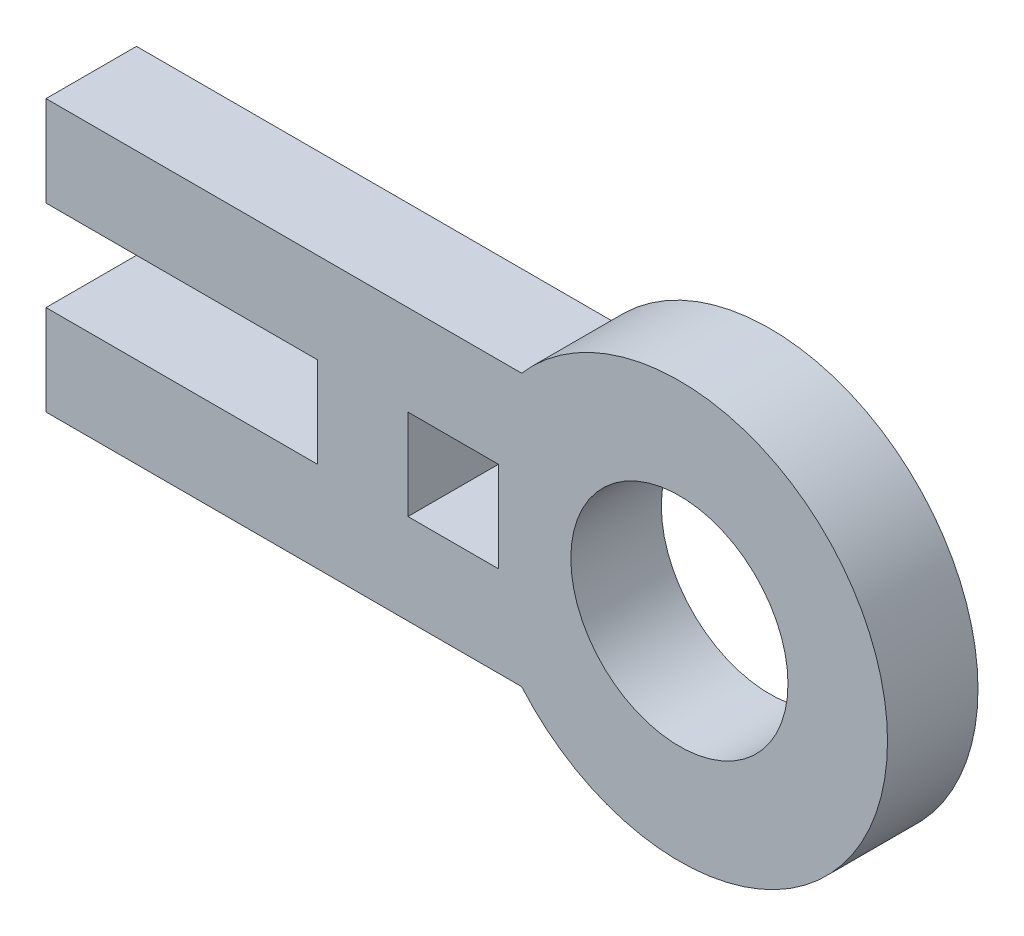
ISO-10303-21;
HEADER;
FILE_DESCRIPTION(('STEP AP214'),'2;1');
FILE_NAME('part.step','',(''),(''),'','','');
FILE_SCHEMA(('AUTOMOTIVE_DESIGN { 1 0 10303 214 1 1 1 1 }'));
ENDSEC;
DATA;
#1=APPLICATION_CONTEXT('core data for automotive mechanical design processes');
#2=APPLICATION_PROTOCOL_DEFINITION('international standard','automotive_design',2000,#1);
#3=PRODUCT_CONTEXT('',#1,'mechanical');
#4=PRODUCT('Part','Part','',(#3));
#5=PRODUCT_RELATED_PRODUCT_CATEGORY('part','',(#4));
#6=PRODUCT_DEFINITION_FORMATION('','',#4);
#7=PRODUCT_DEFINITION_CONTEXT('part definition',#1,'design');
#8=PRODUCT_DEFINITION('design','',#6,#7);
#9=PRODUCT_DEFINITION_SHAPE('','',#8);
#10=(LENGTH_UNIT() NAMED_UNIT(*) SI_UNIT(.MILLI.,.METRE.));
#11=(NAMED_UNIT(*) PLANE_ANGLE_UNIT() SI_UNIT($,.RADIAN.));
#12=(NAMED_UNIT(*) SI_UNIT($,.STERADIAN.) SOLID_ANGLE_UNIT());
#13=UNCERTAINTY_MEASURE_WITH_UNIT(LENGTH_MEASURE(1.E-05),#10,'distance_accuracy_value','');
#14=(GEOMETRIC_REPRESENTATION_CONTEXT(3) GLOBAL_UNCERTAINTY_ASSIGNED_CONTEXT((#13)) GLOBAL_UNIT_ASSIGNED_CONTEXT((#10,
#11,#12)) REPRESENTATION_CONTEXT('',''));
#15=CARTESIAN_POINT('',(0.,0.,0.));
#16=DIRECTION('',(0.,0.,1.));
#17=DIRECTION('',(1.,0.,0.));
#18=AXIS2_PLACEMENT_3D('',#15,#16,#17);
#19=CARTESIAN_POINT('',(0.,0.,5.));
#20=DIRECTION('',(0.,0.,1.));
#21=DIRECTION('',(1.,0.,0.));
#22=AXIS2_PLACEMENT_3D('',#19,#20,#21);
#23=PLANE('',#22);
#24=DIRECTION('',(0.,1.,0.));
#25=VECTOR('',#24,1.);
#26=CARTESIAN_POINT('',(-20.,0.,5.));
#27=LINE('',#26,#25);
#28=CARTESIAN_POINT('',(-20.,-2.5,5.));
#29=VERTEX_POINT('',#28);
#30=CARTESIAN_POINT('',(-20.,2.5,5.));
#31=VERTEX_POINT('',#30);
#32=EDGE_CURVE('E156',#29,#31,#27,.T.);
#33=ORIENTED_EDGE('',*,*,#32,.F.);
#34=DIRECTION('',(-1.,0.,0.));
#35=VECTOR('',#34,1.);
#36=CARTESIAN_POINT('',(0.,-2.49999999999999,5.));
#37=LINE('',#36,#35);
#38=CARTESIAN_POINT('',(-35.,-2.5,5.));
#39=VERTEX_POINT('',#38);
#40=EDGE_CURVE('E159',#29,#39,#37,.T.);
#41=ORIENTED_EDGE('',*,*,#40,.T.);
#42=DIRECTION('',(0.,1.,0.));
#43=VECTOR('',#42,1.);
#44=CARTESIAN_POINT('',(-35.,0.,5.));
#45=LINE('',#44,#43);
#46=CARTESIAN_POINT('',(-35.,-7.5,5.));
#47=VERTEX_POINT('',#46);
#48=EDGE_CURVE('E162',#47,#39,#45,.T.);
#49=ORIENTED_EDGE('',*,*,#48,.F.);
#50=DIRECTION('',(-1.,0.,0.));
#51=VECTOR('',#50,1.);
#52=CARTESIAN_POINT('',(0.,-7.5,5.));
#53=LINE('',#52,#51);
#54=CARTESIAN_POINT('',(-8.71779788708135,-7.5,5.));
#55=VERTEX_POINT('',#54);
#56=EDGE_CURVE('E165',#55,#47,#53,.T.);
#57=ORIENTED_EDGE('',*,*,#56,.F.);
#58=CARTESIAN_POINT('',(0.,0.,5.));
#59=DIRECTION('',(0.,0.,1.));
#60=DIRECTION('',(1.,0.,0.));
#61=AXIS2_PLACEMENT_3D('',#58,#59,#60);
#62=CIRCLE('',#61,11.5);
#63=CARTESIAN_POINT('',(-8.71779788708135,7.5,5.));
#64=VERTEX_POINT('',#63);
#65=EDGE_CURVE('E168',#55,#64,#62,.T.);
#66=ORIENTED_EDGE('',*,*,#65,.T.);
#67=DIRECTION('',(1.,0.,0.));
#68=VECTOR('',#67,1.);
#69=CARTESIAN_POINT('',(0.,7.5,5.));
#70=LINE('',#69,#68);
#71=CARTESIAN_POINT('',(-35.,7.5,5.));
#72=VERTEX_POINT('',#71);
#73=EDGE_CURVE('E170',#72,#64,#70,.T.);
#74=ORIENTED_EDGE('',*,*,#73,.F.);
#75=DIRECTION('',(0.,1.,0.));
#76=VECTOR('',#75,1.);
#77=CARTESIAN_POINT('',(-35.,0.,5.));
#78=LINE('',#77,#76);
#79=CARTESIAN_POINT('',(-35.,2.5,5.));
#80=VERTEX_POINT('',#79);
#81=EDGE_CURVE('E173',#80,#72,#78,.T.);
#82=ORIENTED_EDGE('',*,*,#81,.F.);
#83=DIRECTION('',(-1.,0.,0.));
#84=VECTOR('',#83,1.);
#85=CARTESIAN_POINT('',(0.,2.5,5.));
#86=LINE('',#85,#84);
#87=EDGE_CURVE('E176',#31,#80,#86,.T.);
#88=ORIENTED_EDGE('',*,*,#87,.F.);
#89=EDGE_LOOP('',(#33,#41,#49,#57,#66,#74,#82,#88));
#90=FACE_BOUND('',#89,.T.);
#91=CARTESIAN_POINT('',(0.,0.,5.));
#92=DIRECTION('',(0.,0.,1.));
#93=DIRECTION('',(1.,0.,0.));
#94=AXIS2_PLACEMENT_3D('',#91,#92,#93);
#95=CIRCLE('',#94,6.);
#96=CARTESIAN_POINT('',(6.,0.,5.));
#97=VERTEX_POINT('',#96);
#98=EDGE_CURVE('E179',#97,#97,#95,.T.);
#99=ORIENTED_EDGE('',*,*,#98,.F.);
#100=EDGE_LOOP('',(#99));
#101=FACE_BOUND('',#100,.T.);
#102=DIRECTION('',(1.,0.,0.));
#103=VECTOR('',#102,1.);
#104=CARTESIAN_POINT('',(0.,-2.5,5.));
#105=LINE('',#104,#103);
#106=CARTESIAN_POINT('',(-15.,-2.5,5.));
#107=VERTEX_POINT('',#106);
#108=CARTESIAN_POINT('',(-10.,-2.5,5.));
#109=VERTEX_POINT('',#108);
#110=EDGE_CURVE('E146',#107,#109,#105,.T.);
#111=ORIENTED_EDGE('',*,*,#110,.F.);
#112=DIRECTION('',(0.,1.,0.));
#113=VECTOR('',#112,1.);
#114=CARTESIAN_POINT('',(-15.,0.,5.));
#115=LINE('',#114,#113);
#116=CARTESIAN_POINT('',(-15.,2.5,5.));
#117=VERTEX_POINT('',#116);
#118=EDGE_CURVE('E47',#107,#117,#115,.T.);
#119=ORIENTED_EDGE('',*,*,#118,.T.);
#120=DIRECTION('',(-1.,0.,0.));
#121=VECTOR('',#120,1.);
#122=CARTESIAN_POINT('',(0.,2.5,5.));
#123=LINE('',#122,#121);
#124=CARTESIAN_POINT('',(-10.,2.5,5.));
#125=VERTEX_POINT('',#124);
#126=EDGE_CURVE('E137',#125,#117,#123,.T.);
#127=ORIENTED_EDGE('',*,*,#126,.F.);
#128=DIRECTION('',(0.,1.,0.));
#129=VECTOR('',#128,1.);
#130=CARTESIAN_POINT('',(-10.,0.,5.));
#131=LINE('',#130,#129);
#132=EDGE_CURVE('E140',#109,#125,#131,.T.);
#133=ORIENTED_EDGE('',*,*,#132,.F.);
#134=EDGE_LOOP('',(#111,#119,#127,#133));
#135=FACE_BOUND('',#134,.T.);
#136=ADVANCED_FACE('F32',(#90,#101,#135),#23,.T.);
#137=CARTESIAN_POINT('',(0.,0.,0.));
#138=DIRECTION('',(0.,0.,1.));
#139=DIRECTION('',(1.,0.,0.));
#140=AXIS2_PLACEMENT_3D('',#137,#138,#139);
#141=PLANE('',#140);
#142=CARTESIAN_POINT('',(0.,0.,0.));
#143=DIRECTION('',(0.,0.,1.));
#144=DIRECTION('',(1.,0.,0.));
#145=AXIS2_PLACEMENT_3D('',#142,#143,#144);
#146=CIRCLE('',#145,6.);
#147=CARTESIAN_POINT('',(6.,0.,0.));
#148=VERTEX_POINT('',#147);
#149=EDGE_CURVE('E160',#148,#148,#146,.T.);
#150=ORIENTED_EDGE('',*,*,#149,.T.);
#151=EDGE_LOOP('',(#150));
#152=FACE_BOUND('',#151,.T.);
#153=DIRECTION('',(0.,1.,0.));
#154=VECTOR('',#153,1.);
#155=CARTESIAN_POINT('',(-20.,0.,0.));
#156=LINE('',#155,#154);
#157=CARTESIAN_POINT('',(-20.,-2.5,0.));
#158=VERTEX_POINT('',#157);
#159=CARTESIAN_POINT('',(-20.,2.5,0.));
#160=VERTEX_POINT('',#159);
#161=EDGE_CURVE('E152',#158,#160,#156,.T.);
#162=ORIENTED_EDGE('',*,*,#161,.T.);
#163=DIRECTION('',(-1.,0.,0.));
#164=VECTOR('',#163,1.);
#165=CARTESIAN_POINT('',(0.,2.5,0.));
#166=LINE('',#165,#164);
#167=CARTESIAN_POINT('',(-35.,2.5,0.));
#168=VERTEX_POINT('',#167);
#169=EDGE_CURVE('E203',#160,#168,#166,.T.);
#170=ORIENTED_EDGE('',*,*,#169,.T.);
#171=DIRECTION('',(0.,1.,0.));
#172=VECTOR('',#171,1.);
#173=CARTESIAN_POINT('',(-35.,0.,0.));
#174=LINE('',#173,#172);
#175=CARTESIAN_POINT('',(-35.,7.5,0.));
#176=VERTEX_POINT('',#175);
#177=EDGE_CURVE('E200',#168,#176,#174,.T.);
#178=ORIENTED_EDGE('',*,*,#177,.T.);
#179=DIRECTION('',(1.,0.,0.));
#180=VECTOR('',#179,1.);
#181=CARTESIAN_POINT('',(0.,7.5,0.));
#182=LINE('',#181,#180);
#183=CARTESIAN_POINT('',(-8.71779788708135,7.5,0.));
#184=VERTEX_POINT('',#183);
#185=EDGE_CURVE('E197',#176,#184,#182,.T.);
#186=ORIENTED_EDGE('',*,*,#185,.T.);
#187=CARTESIAN_POINT('',(0.,0.,0.));
#188=DIRECTION('',(0.,0.,1.));
#189=DIRECTION('',(1.,0.,0.));
#190=AXIS2_PLACEMENT_3D('',#187,#188,#189);
#191=CIRCLE('',#190,11.5);
#192=CARTESIAN_POINT('',(-8.71779788708135,-7.5,0.));
#193=VERTEX_POINT('',#192);
#194=EDGE_CURVE('E194',#193,#184,#191,.T.);
#195=ORIENTED_EDGE('',*,*,#194,.F.);
#196=DIRECTION('',(-1.,0.,0.));
#197=VECTOR('',#196,1.);
#198=CARTESIAN_POINT('',(0.,-7.5,0.));
#199=LINE('',#198,#197);
#200=CARTESIAN_POINT('',(-35.,-7.5,0.));
#201=VERTEX_POINT('',#200);
#202=EDGE_CURVE('E191',#193,#201,#199,.T.);
#203=ORIENTED_EDGE('',*,*,#202,.T.);
#204=DIRECTION('',(0.,1.,0.));
#205=VECTOR('',#204,1.);
#206=CARTESIAN_POINT('',(-35.,0.,0.));
#207=LINE('',#206,#205);
#208=CARTESIAN_POINT('',(-35.,-2.5,0.));
#209=VERTEX_POINT('',#208);
#210=EDGE_CURVE('E188',#201,#209,#207,.T.);
#211=ORIENTED_EDGE('',*,*,#210,.T.);
#212=DIRECTION('',(-1.,0.,0.));
#213=VECTOR('',#212,1.);
#214=CARTESIAN_POINT('',(0.,-2.49999999999999,0.));
#215=LINE('',#214,#213);
#216=EDGE_CURVE('E185',#158,#209,#215,.T.);
#217=ORIENTED_EDGE('',*,*,#216,.F.);
#218=EDGE_LOOP('',(#162,#170,#178,#186,#195,#203,#211,#217));
#219=FACE_BOUND('',#218,.T.);
#220=DIRECTION('',(0.,1.,0.));
#221=VECTOR('',#220,1.);
#222=CARTESIAN_POINT('',(-15.,0.,0.));
#223=LINE('',#222,#221);
#224=CARTESIAN_POINT('',(-15.,-2.5,0.));
#225=VERTEX_POINT('',#224);
#226=CARTESIAN_POINT('',(-15.,2.5,0.));
#227=VERTEX_POINT('',#226);
#228=EDGE_CURVE('E121',#225,#227,#223,.T.);
#229=ORIENTED_EDGE('',*,*,#228,.F.);
#230=DIRECTION('',(1.,0.,0.));
#231=VECTOR('',#230,1.);
#232=CARTESIAN_POINT('',(0.,-2.5,0.));
#233=LINE('',#232,#231);
#234=CARTESIAN_POINT('',(-10.,-2.5,0.));
#235=VERTEX_POINT('',#234);
#236=EDGE_CURVE('E130',#225,#235,#233,.T.);
#237=ORIENTED_EDGE('',*,*,#236,.T.);
#238=DIRECTION('',(0.,1.,0.));
#239=VECTOR('',#238,1.);
#240=CARTESIAN_POINT('',(-10.,0.,0.));
#241=LINE('',#240,#239);
#242=CARTESIAN_POINT('',(-10.,2.5,0.));
#243=VERTEX_POINT('',#242);
#244=EDGE_CURVE('E55',#235,#243,#241,.T.);
#245=ORIENTED_EDGE('',*,*,#244,.T.);
#246=DIRECTION('',(-1.,0.,0.));
#247=VECTOR('',#246,1.);
#248=CARTESIAN_POINT('',(0.,2.5,0.));
#249=LINE('',#248,#247);
#250=EDGE_CURVE('E127',#243,#227,#249,.T.);
#251=ORIENTED_EDGE('',*,*,#250,.T.);
#252=EDGE_LOOP('',(#229,#237,#245,#251));
#253=FACE_BOUND('',#252,.T.);
#254=ADVANCED_FACE('F135',(#152,#219,#253),#141,.F.);
#255=CARTESIAN_POINT('',(-20.,0.,5.));
#256=DIRECTION('',(-1.,0.,0.));
#257=DIRECTION('',(0.,0.,1.));
#258=AXIS2_PLACEMENT_3D('',#255,#256,#257);
#259=PLANE('',#258);
#260=ORIENTED_EDGE('',*,*,#161,.F.);
#261=DIRECTION('',(0.,0.,-1.));
#262=VECTOR('',#261,1.);
#263=CARTESIAN_POINT('',(-20.,-2.5,5.));
#264=LINE('',#263,#262);
#265=EDGE_CURVE('E11',#29,#158,#264,.T.);
#266=ORIENTED_EDGE('',*,*,#265,.F.);
#267=ORIENTED_EDGE('',*,*,#32,.T.);
#268=DIRECTION('',(0.,0.,-1.));
#269=VECTOR('',#268,1.);
#270=CARTESIAN_POINT('',(-20.,2.5,5.));
#271=LINE('',#270,#269);
#272=EDGE_CURVE('E182',#31,#160,#271,.T.);
#273=ORIENTED_EDGE('',*,*,#272,.T.);
#274=EDGE_LOOP('',(#260,#266,#267,#273));
#275=FACE_BOUND('',#274,.T.);
#276=ADVANCED_FACE('F34',(#275),#259,.T.);
#277=CARTESIAN_POINT('',(0.,-2.49999999999999,5.));
#278=DIRECTION('',(0.,-1.,0.));
#279=DIRECTION('',(1.,0.,0.));
#280=AXIS2_PLACEMENT_3D('',#277,#278,#279);
#281=PLANE('',#280);
#282=ORIENTED_EDGE('',*,*,#216,.T.);
#283=DIRECTION('',(0.,0.,-1.));
#284=VECTOR('',#283,1.);
#285=CARTESIAN_POINT('',(-35.,-2.5,5.));
#286=LINE('',#285,#284);
#287=EDGE_CURVE('E40',#39,#209,#286,.T.);
#288=ORIENTED_EDGE('',*,*,#287,.F.);
#289=ORIENTED_EDGE('',*,*,#40,.F.);
#290=ORIENTED_EDGE('',*,*,#265,.T.);
#291=EDGE_LOOP('',(#282,#288,#289,#290));
#292=FACE_BOUND('',#291,.T.);
#293=ADVANCED_FACE('F226',(#292),#281,.F.);
#294=CARTESIAN_POINT('',(-35.,0.,5.));
#295=DIRECTION('',(-1.,0.,0.));
#296=DIRECTION('',(0.,0.,1.));
#297=AXIS2_PLACEMENT_3D('',#294,#295,#296);
#298=PLANE('',#297);
#299=ORIENTED_EDGE('',*,*,#210,.F.);
#300=DIRECTION('',(0.,0.,-1.));
#301=VECTOR('',#300,1.);
#302=CARTESIAN_POINT('',(-35.,-7.5,5.));
#303=LINE('',#302,#301);
#304=EDGE_CURVE('E217',#47,#201,#303,.T.);
#305=ORIENTED_EDGE('',*,*,#304,.F.);
#306=ORIENTED_EDGE('',*,*,#48,.T.);
#307=ORIENTED_EDGE('',*,*,#287,.T.);
#308=EDGE_LOOP('',(#299,#305,#306,#307));
#309=FACE_BOUND('',#308,.T.);
#310=ADVANCED_FACE('F221',(#309),#298,.T.);
#311=CARTESIAN_POINT('',(0.,-7.5,5.));
#312=DIRECTION('',(0.,-1.,0.));
#313=DIRECTION('',(1.,0.,0.));
#314=AXIS2_PLACEMENT_3D('',#311,#312,#313);
#315=PLANE('',#314);
#316=ORIENTED_EDGE('',*,*,#202,.F.);
#317=DIRECTION('',(0.,0.,-1.));
#318=VECTOR('',#317,1.);
#319=CARTESIAN_POINT('',(-8.71779788708135,-7.5,5.));
#320=LINE('',#319,#318);
#321=EDGE_CURVE('E215',#55,#193,#320,.T.);
#322=ORIENTED_EDGE('',*,*,#321,.F.);
#323=ORIENTED_EDGE('',*,*,#56,.T.);
#324=ORIENTED_EDGE('',*,*,#304,.T.);
#325=EDGE_LOOP('',(#316,#322,#323,#324));
#326=FACE_BOUND('',#325,.T.);
#327=ADVANCED_FACE('F232',(#326),#315,.T.);
#328=CARTESIAN_POINT('',(0.,0.,5.));
#329=DIRECTION('',(0.,0.,-1.));
#330=DIRECTION('',(-1.,0.,0.));
#331=AXIS2_PLACEMENT_3D('',#328,#329,#330);
#332=CYLINDRICAL_SURFACE('',#331,11.5);
#333=ORIENTED_EDGE('',*,*,#194,.T.);
#334=DIRECTION('',(0.,0.,-1.));
#335=VECTOR('',#334,1.);
#336=CARTESIAN_POINT('',(-8.71779788708135,7.5,5.));
#337=LINE('',#336,#335);
#338=EDGE_CURVE('E213',#64,#184,#337,.T.);
#339=ORIENTED_EDGE('',*,*,#338,.F.);
#340=ORIENTED_EDGE('',*,*,#65,.F.);
#341=ORIENTED_EDGE('',*,*,#321,.T.);
#342=EDGE_LOOP('',(#333,#339,#340,#341));
#343=FACE_BOUND('',#342,.T.);
#344=ADVANCED_FACE('F253',(#343),#332,.T.);
#345=CARTESIAN_POINT('',(0.,7.5,5.));
#346=DIRECTION('',(0.,1.,0.));
#347=DIRECTION('',(-1.,0.,0.));
#348=AXIS2_PLACEMENT_3D('',#345,#346,#347);
#349=PLANE('',#348);
#350=ORIENTED_EDGE('',*,*,#185,.F.);
#351=DIRECTION('',(0.,0.,-1.));
#352=VECTOR('',#351,1.);
#353=CARTESIAN_POINT('',(-35.,7.5,5.));
#354=LINE('',#353,#352);
#355=EDGE_CURVE('E211',#72,#176,#354,.T.);
#356=ORIENTED_EDGE('',*,*,#355,.F.);
#357=ORIENTED_EDGE('',*,*,#73,.T.);
#358=ORIENTED_EDGE('',*,*,#338,.T.);
#359=EDGE_LOOP('',(#350,#356,#357,#358));
#360=FACE_BOUND('',#359,.T.);
#361=ADVANCED_FACE('F249',(#360),#349,.T.);
#362=CARTESIAN_POINT('',(-35.,0.,5.));
#363=DIRECTION('',(-1.,0.,0.));
#364=DIRECTION('',(0.,0.,1.));
#365=AXIS2_PLACEMENT_3D('',#362,#363,#364);
#366=PLANE('',#365);
#367=ORIENTED_EDGE('',*,*,#177,.F.);
#368=DIRECTION('',(0.,0.,-1.));
#369=VECTOR('',#368,1.);
#370=CARTESIAN_POINT('',(-35.,2.5,5.));
#371=LINE('',#370,#369);
#372=EDGE_CURVE('E209',#80,#168,#371,.T.);
#373=ORIENTED_EDGE('',*,*,#372,.F.);
#374=ORIENTED_EDGE('',*,*,#81,.T.);
#375=ORIENTED_EDGE('',*,*,#355,.T.);
#376=EDGE_LOOP('',(#367,#373,#374,#375));
#377=FACE_BOUND('',#376,.T.);
#378=ADVANCED_FACE('F246',(#377),#366,.T.);
#379=CARTESIAN_POINT('',(0.,2.5,5.));
#380=DIRECTION('',(0.,-1.,0.));
#381=DIRECTION('',(1.,0.,0.));
#382=AXIS2_PLACEMENT_3D('',#379,#380,#381);
#383=PLANE('',#382);
#384=ORIENTED_EDGE('',*,*,#169,.F.);
#385=ORIENTED_EDGE('',*,*,#272,.F.);
#386=ORIENTED_EDGE('',*,*,#87,.T.);
#387=ORIENTED_EDGE('',*,*,#372,.T.);
#388=EDGE_LOOP('',(#384,#385,#386,#387));
#389=FACE_BOUND('',#388,.T.);
#390=ADVANCED_FACE('F243',(#389),#383,.T.);
#391=CARTESIAN_POINT('',(0.,0.,5.));
#392=DIRECTION('',(0.,0.,-1.));
#393=DIRECTION('',(-1.,0.,0.));
#394=AXIS2_PLACEMENT_3D('',#391,#392,#393);
#395=CYLINDRICAL_SURFACE('',#394,6.);
#396=ORIENTED_EDGE('',*,*,#98,.T.);
#397=EDGE_LOOP('',(#396));
#398=FACE_BOUND('',#397,.T.);
#399=ORIENTED_EDGE('',*,*,#149,.F.);
#400=EDGE_LOOP('',(#399));
#401=FACE_BOUND('',#400,.T.);
#402=ADVANCED_FACE('F272',(#398,#401),#395,.F.);
#403=CARTESIAN_POINT('',(-15.,0.,0.));
#404=DIRECTION('',(1.,0.,0.));
#405=DIRECTION('',(0.,0.,-1.));
#406=AXIS2_PLACEMENT_3D('',#403,#404,#405);
#407=PLANE('',#406);
#408=ORIENTED_EDGE('',*,*,#118,.F.);
#409=DIRECTION('',(0.,0.,1.));
#410=VECTOR('',#409,1.);
#411=CARTESIAN_POINT('',(-15.,-2.5,0.));
#412=LINE('',#411,#410);
#413=EDGE_CURVE('E117',#225,#107,#412,.T.);
#414=ORIENTED_EDGE('',*,*,#413,.F.);
#415=ORIENTED_EDGE('',*,*,#228,.T.);
#416=DIRECTION('',(0.,0.,1.));
#417=VECTOR('',#416,1.);
#418=CARTESIAN_POINT('',(-15.,2.5,0.));
#419=LINE('',#418,#417);
#420=EDGE_CURVE('E150',#227,#117,#419,.T.);
#421=ORIENTED_EDGE('',*,*,#420,.T.);
#422=EDGE_LOOP('',(#408,#414,#415,#421));
#423=FACE_BOUND('',#422,.T.);
#424=ADVANCED_FACE('F119',(#423),#407,.T.);
#425=CARTESIAN_POINT('',(0.,2.5,0.));
#426=DIRECTION('',(0.,1.,0.));
#427=DIRECTION('',(-1.,0.,0.));
#428=AXIS2_PLACEMENT_3D('',#425,#426,#427);
#429=PLANE('',#428);
#430=ORIENTED_EDGE('',*,*,#126,.T.);
#431=ORIENTED_EDGE('',*,*,#420,.F.);
#432=ORIENTED_EDGE('',*,*,#250,.F.);
#433=DIRECTION('',(0.,0.,1.));
#434=VECTOR('',#433,1.);
#435=CARTESIAN_POINT('',(-10.,2.5,0.));
#436=LINE('',#435,#434);
#437=EDGE_CURVE('E153',#243,#125,#436,.T.);
#438=ORIENTED_EDGE('',*,*,#437,.T.);
#439=EDGE_LOOP('',(#430,#431,#432,#438));
#440=FACE_BOUND('',#439,.T.);
#441=ADVANCED_FACE('F297',(#440),#429,.F.);
#442=CARTESIAN_POINT('',(-10.,0.,0.));
#443=DIRECTION('',(1.,0.,0.));
#444=DIRECTION('',(0.,0.,-1.));
#445=AXIS2_PLACEMENT_3D('',#442,#443,#444);
#446=PLANE('',#445);
#447=ORIENTED_EDGE('',*,*,#132,.T.);
#448=ORIENTED_EDGE('',*,*,#437,.F.);
#449=ORIENTED_EDGE('',*,*,#244,.F.);
#450=DIRECTION('',(0.,0.,1.));
#451=VECTOR('',#450,1.);
#452=CARTESIAN_POINT('',(-10.,-2.5,0.));
#453=LINE('',#452,#451);
#454=EDGE_CURVE('E126',#235,#109,#453,.T.);
#455=ORIENTED_EDGE('',*,*,#454,.T.);
#456=EDGE_LOOP('',(#447,#448,#449,#455));
#457=FACE_BOUND('',#456,.T.);
#458=ADVANCED_FACE('F304',(#457),#446,.F.);
#459=CARTESIAN_POINT('',(0.,-2.5,0.));
#460=DIRECTION('',(0.,-1.,0.));
#461=DIRECTION('',(0.,0.,-1.));
#462=AXIS2_PLACEMENT_3D('',#459,#460,#461);
#463=PLANE('',#462);
#464=ORIENTED_EDGE('',*,*,#110,.T.);
#465=ORIENTED_EDGE('',*,*,#454,.F.);
#466=ORIENTED_EDGE('',*,*,#236,.F.);
#467=ORIENTED_EDGE('',*,*,#413,.T.);
#468=EDGE_LOOP('',(#464,#465,#466,#467));
#469=FACE_BOUND('',#468,.T.);
#470=ADVANCED_FACE('F131',(#469),#463,.F.);
#471=CLOSED_SHELL('',(#136,#254,#276,#293,#310,#327,#344,#361,#378,#390,#402,#424,#441,#458,#470));
#472=MANIFOLD_SOLID_BREP('B2',#471);
#473=ADVANCED_BREP_SHAPE_REPRESENTATION('',(#18,#472),#14);
#474=SHAPE_DEFINITION_REPRESENTATION(#9,#473);
ENDSEC;
END-ISO-10303-21;
